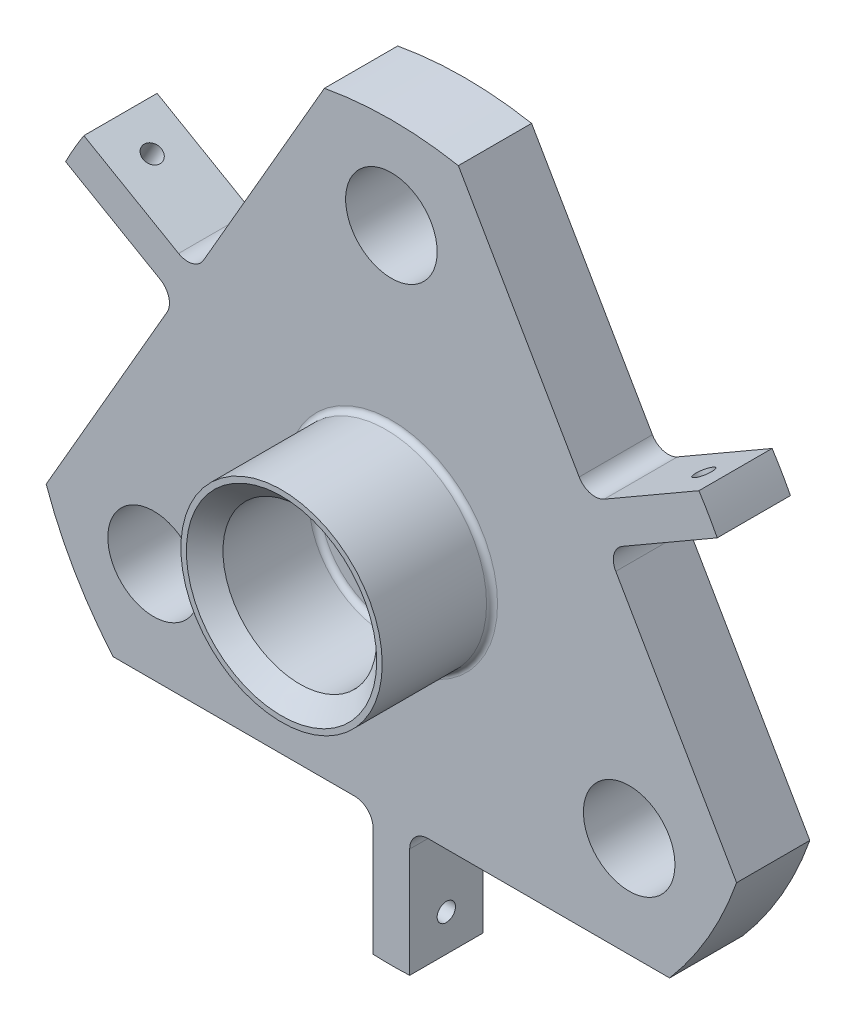
ISO-10303-21;
HEADER;
FILE_DESCRIPTION(('STEP AP214'),'2;1');
FILE_NAME('part.step','',(''),(''),'','','');
FILE_SCHEMA(('AUTOMOTIVE_DESIGN { 1 0 10303 214 1 1 1 1 }'));
ENDSEC;
DATA;
#1=APPLICATION_CONTEXT('core data for automotive mechanical design processes');
#2=APPLICATION_PROTOCOL_DEFINITION('international standard','automotive_design',2000,#1);
#3=PRODUCT_CONTEXT('',#1,'mechanical');
#4=PRODUCT('Part','Part','',(#3));
#5=PRODUCT_RELATED_PRODUCT_CATEGORY('part','',(#4));
#6=PRODUCT_DEFINITION_FORMATION('','',#4);
#7=PRODUCT_DEFINITION_CONTEXT('part definition',#1,'design');
#8=PRODUCT_DEFINITION('design','',#6,#7);
#9=PRODUCT_DEFINITION_SHAPE('','',#8);
#10=(LENGTH_UNIT() NAMED_UNIT(*) SI_UNIT(.MILLI.,.METRE.));
#11=(NAMED_UNIT(*) PLANE_ANGLE_UNIT() SI_UNIT($,.RADIAN.));
#12=(NAMED_UNIT(*) SI_UNIT($,.STERADIAN.) SOLID_ANGLE_UNIT());
#13=UNCERTAINTY_MEASURE_WITH_UNIT(LENGTH_MEASURE(1.E-05),#10,'distance_accuracy_value','');
#14=(GEOMETRIC_REPRESENTATION_CONTEXT(3) GLOBAL_UNCERTAINTY_ASSIGNED_CONTEXT((#13)) GLOBAL_UNIT_ASSIGNED_CONTEXT((#10,
#11,#12)) REPRESENTATION_CONTEXT('',''));
#15=CARTESIAN_POINT('',(0.,0.,0.));
#16=DIRECTION('',(0.,0.,1.));
#17=DIRECTION('',(1.,0.,0.));
#18=AXIS2_PLACEMENT_3D('',#15,#16,#17);
#19=CARTESIAN_POINT('',(0.,0.,0.));
#20=DIRECTION('',(0.,0.,1.));
#21=DIRECTION('',(1.,0.,0.));
#22=AXIS2_PLACEMENT_3D('',#19,#20,#21);
#23=PLANE('',#22);
#24=CARTESIAN_POINT('',(-64.9519052838329,-37.5,0.));
#25=DIRECTION('',(0.,0.,1.));
#26=DIRECTION('',(1.,0.,0.));
#27=AXIS2_PLACEMENT_3D('',#24,#25,#26);
#28=CIRCLE('',#27,12.5);
#29=CARTESIAN_POINT('',(-52.4519052838329,-37.5,0.));
#30=VERTEX_POINT('',#29);
#31=EDGE_CURVE('E711',#30,#30,#28,.T.);
#32=ORIENTED_EDGE('',*,*,#31,.T.);
#33=EDGE_LOOP('',(#32));
#34=FACE_BOUND('',#33,.T.);
#35=CARTESIAN_POINT('',(64.9519052838329,-37.5,0.));
#36=DIRECTION('',(0.,0.,1.));
#37=DIRECTION('',(1.,0.,0.));
#38=AXIS2_PLACEMENT_3D('',#35,#36,#37);
#39=CIRCLE('',#38,12.5);
#40=CARTESIAN_POINT('',(77.4519052838329,-37.5,0.));
#41=VERTEX_POINT('',#40);
#42=EDGE_CURVE('E725',#41,#41,#39,.T.);
#43=ORIENTED_EDGE('',*,*,#42,.T.);
#44=EDGE_LOOP('',(#43));
#45=FACE_BOUND('',#44,.T.);
#46=CARTESIAN_POINT('',(0.,75.,0.));
#47=DIRECTION('',(0.,0.,1.));
#48=DIRECTION('',(1.,0.,0.));
#49=AXIS2_PLACEMENT_3D('',#46,#47,#48);
#50=CIRCLE('',#49,12.5);
#51=CARTESIAN_POINT('',(12.5,75.,0.));
#52=VERTEX_POINT('',#51);
#53=EDGE_CURVE('E712',#52,#52,#50,.T.);
#54=ORIENTED_EDGE('',*,*,#53,.T.);
#55=EDGE_LOOP('',(#54));
#56=FACE_BOUND('',#55,.T.);
#57=DIRECTION('',(0.5,0.866025403784438,0.));
#58=VECTOR('',#57,1.);
#59=CARTESIAN_POINT('',(-51.2916512459883,41.1602540378444,0.));
#60=LINE('',#59,#58);
#61=CARTESIAN_POINT('',(-51.2916512459883,41.1602540378444,0.));
#62=VERTEX_POINT('',#61);
#63=CARTESIAN_POINT('',(-18.2949408620616,98.312232905441,0.));
#64=VERTEX_POINT('',#63);
#65=EDGE_CURVE('E609',#62,#64,#60,.T.);
#66=ORIENTED_EDGE('',*,*,#65,.T.);
#67=CARTESIAN_POINT('',(0.,0.,0.));
#68=DIRECTION('',(0.,0.,1.));
#69=DIRECTION('',(1.,0.,0.));
#70=AXIS2_PLACEMENT_3D('',#67,#68,#69);
#71=CIRCLE('',#70,100.);
#72=CARTESIAN_POINT('',(18.2949408620678,98.3122329054398,0.));
#73=VERTEX_POINT('',#72);
#74=EDGE_CURVE('E746',#73,#64,#71,.T.);
#75=ORIENTED_EDGE('',*,*,#74,.F.);
#76=DIRECTION('',(-0.5,0.866025403784439,0.));
#77=VECTOR('',#76,1.);
#78=CARTESIAN_POINT('',(51.2916512459925,41.1602540378466,0.));
#79=LINE('',#78,#77);
#80=CARTESIAN_POINT('',(51.2916512459925,41.1602540378466,0.));
#81=VERTEX_POINT('',#80);
#82=EDGE_CURVE('E574',#81,#73,#79,.T.);
#83=ORIENTED_EDGE('',*,*,#82,.F.);
#84=CARTESIAN_POINT('',(55.621778264911,43.6602540378445,0.));
#85=DIRECTION('',(0.,0.,-1.));
#86=DIRECTION('',(-1.,0.,0.));
#87=AXIS2_PLACEMENT_3D('',#84,#85,#86);
#88=CIRCLE('',#87,4.99999999999548);
#89=CARTESIAN_POINT('',(58.1217782649084,39.330127018926,0.));
#90=VERTEX_POINT('',#89);
#91=EDGE_CURVE('E565',#90,#81,#88,.T.);
#92=ORIENTED_EDGE('',*,*,#91,.F.);
#93=DIRECTION('',(-0.866025403784438,-0.500000000000001,0.));
#94=VECTOR('',#93,1.);
#95=CARTESIAN_POINT('',(110.083302491975,69.3301270189263,0.));
#96=LINE('',#95,#94);
#97=CARTESIAN_POINT('',(83.9942194600286,54.2675879075213,0.));
#98=VERTEX_POINT('',#97);
#99=EDGE_CURVE('E552',#98,#90,#96,.T.);
#100=ORIENTED_EDGE('',*,*,#99,.F.);
#101=CARTESIAN_POINT('',(88.994219460031,45.6073338696731,0.));
#102=VERTEX_POINT('',#101);
#103=EDGE_CURVE('E743',#102,#98,#71,.T.);
#104=ORIENTED_EDGE('',*,*,#103,.F.);
#105=DIRECTION('',(-0.866025403784438,-0.500000000000001,0.));
#106=VECTOR('',#105,1.);
#107=CARTESIAN_POINT('',(115.083302491977,60.6698729810777,0.));
#108=LINE('',#107,#106);
#109=CARTESIAN_POINT('',(63.1217782649107,30.6698729810778,0.));
#110=VERTEX_POINT('',#109);
#111=EDGE_CURVE('E658',#102,#110,#108,.T.);
#112=ORIENTED_EDGE('',*,*,#111,.T.);
#113=CARTESIAN_POINT('',(65.6217782649107,26.3397459621556,0.));
#114=DIRECTION('',(0.,0.,-1.));
#115=DIRECTION('',(-1.,0.,0.));
#116=AXIS2_PLACEMENT_3D('',#113,#114,#115);
#117=CIRCLE('',#116,5.);
#118=CARTESIAN_POINT('',(61.2916512459885,23.8397459621556,0.));
#119=VERTEX_POINT('',#118);
#120=EDGE_CURVE('E654',#119,#110,#117,.T.);
#121=ORIENTED_EDGE('',*,*,#120,.F.);
#122=DIRECTION('',(0.5,-0.866025403784439,0.));
#123=VECTOR('',#122,1.);
#124=CARTESIAN_POINT('',(61.2916512459886,23.8397459621555,0.));
#125=LINE('',#124,#123);
#126=CARTESIAN_POINT('',(94.2883616299152,-33.312232905441,0.));
#127=VERTEX_POINT('',#126);
#128=EDGE_CURVE('E622',#119,#127,#125,.T.);
#129=ORIENTED_EDGE('',*,*,#128,.T.);
#130=CARTESIAN_POINT('',(75.9934207678494,-65.0000000000045,0.));
#131=VERTEX_POINT('',#130);
#132=EDGE_CURVE('E716',#131,#127,#71,.T.);
#133=ORIENTED_EDGE('',*,*,#132,.F.);
#134=DIRECTION('',(1.,0.,0.));
#135=VECTOR('',#134,1.);
#136=CARTESIAN_POINT('',(10.,-65.0000000000045,0.));
#137=LINE('',#136,#135);
#138=CARTESIAN_POINT('',(10.,-65.0000000000045,0.));
#139=VERTEX_POINT('',#138);
#140=EDGE_CURVE('E643',#139,#131,#137,.T.);
#141=ORIENTED_EDGE('',*,*,#140,.F.);
#142=CARTESIAN_POINT('',(10.,-70.,0.));
#143=DIRECTION('',(0.,0.,-1.));
#144=DIRECTION('',(-1.,0.,0.));
#145=AXIS2_PLACEMENT_3D('',#142,#143,#144);
#146=CIRCLE('',#145,4.99999999999547);
#147=CARTESIAN_POINT('',(5.00000000000454,-69.9999999999999,0.));
#148=VERTEX_POINT('',#147);
#149=EDGE_CURVE('E642',#148,#139,#146,.T.);
#150=ORIENTED_EDGE('',*,*,#149,.F.);
#151=DIRECTION('',(0.,1.,0.));
#152=VECTOR('',#151,1.);
#153=CARTESIAN_POINT('',(5.00000000000453,-130.,0.));
#154=LINE('',#153,#152);
#155=CARTESIAN_POINT('',(5.00000000000453,-99.8749217771907,0.));
#156=VERTEX_POINT('',#155);
#157=EDGE_CURVE('E629',#156,#148,#154,.T.);
#158=ORIENTED_EDGE('',*,*,#157,.F.);
#159=CARTESIAN_POINT('',(-5.00000000000001,-99.8749217771909,0.));
#160=VERTEX_POINT('',#159);
#161=EDGE_CURVE('E1073',#160,#156,#71,.T.);
#162=ORIENTED_EDGE('',*,*,#161,.F.);
#163=DIRECTION('',(0.,1.,0.));
#164=VECTOR('',#163,1.);
#165=CARTESIAN_POINT('',(-5.00000000000001,-130.,0.));
#166=LINE('',#165,#164);
#167=CARTESIAN_POINT('',(-5.00000000000001,-70.,0.));
#168=VERTEX_POINT('',#167);
#169=EDGE_CURVE('E590',#160,#168,#166,.T.);
#170=ORIENTED_EDGE('',*,*,#169,.T.);
#171=CARTESIAN_POINT('',(-10.,-70.,0.));
#172=DIRECTION('',(0.,0.,-1.));
#173=DIRECTION('',(-1.,0.,0.));
#174=AXIS2_PLACEMENT_3D('',#171,#172,#173);
#175=CIRCLE('',#174,5.);
#176=CARTESIAN_POINT('',(-10.,-65.,0.));
#177=VERTEX_POINT('',#176);
#178=EDGE_CURVE('E595',#177,#168,#175,.T.);
#179=ORIENTED_EDGE('',*,*,#178,.F.);
#180=DIRECTION('',(-1.,0.,0.));
#181=VECTOR('',#180,1.);
#182=CARTESIAN_POINT('',(-10.,-65.,0.));
#183=LINE('',#182,#181);
#184=CARTESIAN_POINT('',(-75.9934207678533,-65.,0.));
#185=VERTEX_POINT('',#184);
#186=EDGE_CURVE('E591',#177,#185,#183,.T.);
#187=ORIENTED_EDGE('',*,*,#186,.T.);
#188=CARTESIAN_POINT('',(-94.2883616299172,-33.3122329054353,0.));
#189=VERTEX_POINT('',#188);
#190=EDGE_CURVE('E1075',#189,#185,#71,.T.);
#191=ORIENTED_EDGE('',*,*,#190,.F.);
#192=DIRECTION('',(-0.5,-0.866025403784438,0.));
#193=VECTOR('',#192,1.);
#194=CARTESIAN_POINT('',(-61.2916512459924,23.8397459621579,0.));
#195=LINE('',#194,#193);
#196=CARTESIAN_POINT('',(-61.2916512459924,23.8397459621579,0.));
#197=VERTEX_POINT('',#196);
#198=EDGE_CURVE('E619',#197,#189,#195,.T.);
#199=ORIENTED_EDGE('',*,*,#198,.F.);
#200=CARTESIAN_POINT('',(-65.6217782649108,26.3397459621558,0.));
#201=DIRECTION('',(0.,0.,-1.));
#202=DIRECTION('',(-1.,0.,0.));
#203=AXIS2_PLACEMENT_3D('',#200,#201,#202);
#204=CIRCLE('',#203,4.99999999999547);
#205=CARTESIAN_POINT('',(-63.1217782649127,30.6698729810739,0.));
#206=VERTEX_POINT('',#205);
#207=EDGE_CURVE('E633',#206,#197,#204,.T.);
#208=ORIENTED_EDGE('',*,*,#207,.F.);
#209=DIRECTION('',(0.866025403784439,-0.499999999999999,0.));
#210=VECTOR('',#209,1.);
#211=CARTESIAN_POINT('',(-115.08330249198,60.6698729810742,0.));
#212=LINE('',#211,#210);
#213=CARTESIAN_POINT('',(-88.994219460033,45.6073338696693,0.));
#214=VERTEX_POINT('',#213);
#215=EDGE_CURVE('E623',#214,#206,#212,.T.);
#216=ORIENTED_EDGE('',*,*,#215,.F.);
#217=CARTESIAN_POINT('',(-83.9942194600309,54.2675879075178,0.));
#218=VERTEX_POINT('',#217);
#219=EDGE_CURVE('E1079',#218,#214,#71,.T.);
#220=ORIENTED_EDGE('',*,*,#219,.F.);
#221=DIRECTION('',(0.866025403784439,-0.499999999999999,0.));
#222=VECTOR('',#221,1.);
#223=CARTESIAN_POINT('',(-110.083302491977,69.3301270189223,0.));
#224=LINE('',#223,#222);
#225=CARTESIAN_POINT('',(-58.1217782649105,39.3301270189222,0.));
#226=VERTEX_POINT('',#225);
#227=EDGE_CURVE('E608',#218,#226,#224,.T.);
#228=ORIENTED_EDGE('',*,*,#227,.T.);
#229=CARTESIAN_POINT('',(-55.6217782649106,43.6602540378444,0.));
#230=DIRECTION('',(0.,0.,-1.));
#231=DIRECTION('',(-1.,0.,0.));
#232=AXIS2_PLACEMENT_3D('',#229,#230,#231);
#233=CIRCLE('',#232,5.);
#234=EDGE_CURVE('E602',#62,#226,#233,.T.);
#235=ORIENTED_EDGE('',*,*,#234,.F.);
#236=EDGE_LOOP('',(#66,#75,#83,#92,#100,#104,#112,#121,#129,#133,#141,#150,#158,#162,#170,#179,
#187,#191,#199,#208,#216,#220,#228,#235));
#237=FACE_BOUND('',#236,.T.);
#238=ADVANCED_FACE('F388',(#34,#45,#56,#237),#23,.F.);
#239=CARTESIAN_POINT('',(0.,0.,20.));
#240=DIRECTION('',(0.,0.,-1.));
#241=DIRECTION('',(-1.,0.,0.));
#242=AXIS2_PLACEMENT_3D('',#239,#240,#241);
#243=CYLINDRICAL_SURFACE('',#242,100.);
#244=DIRECTION('',(0.,0.,-1.));
#245=VECTOR('',#244,1.);
#246=CARTESIAN_POINT('',(-18.2949408620616,98.312232905441,20.));
#247=LINE('',#246,#245);
#248=CARTESIAN_POINT('',(-18.2949408620616,98.312232905441,20.));
#249=VERTEX_POINT('',#248);
#250=EDGE_CURVE('E708',#249,#64,#247,.T.);
#251=ORIENTED_EDGE('',*,*,#250,.F.);
#252=CARTESIAN_POINT('',(0.,0.,20.));
#253=DIRECTION('',(0.,0.,1.));
#254=DIRECTION('',(1.,0.,0.));
#255=AXIS2_PLACEMENT_3D('',#252,#253,#254);
#256=CIRCLE('',#255,100.);
#257=CARTESIAN_POINT('',(18.2949408620678,98.3122329054398,20.));
#258=VERTEX_POINT('',#257);
#259=EDGE_CURVE('E741',#258,#249,#256,.T.);
#260=ORIENTED_EDGE('',*,*,#259,.F.);
#261=DIRECTION('',(0.,0.,-1.));
#262=VECTOR('',#261,1.);
#263=CARTESIAN_POINT('',(18.2949408620678,98.3122329054398,20.));
#264=LINE('',#263,#262);
#265=EDGE_CURVE('E679',#258,#73,#264,.T.);
#266=ORIENTED_EDGE('',*,*,#265,.T.);
#267=ORIENTED_EDGE('',*,*,#74,.T.);
#268=EDGE_LOOP('',(#251,#260,#266,#267));
#269=FACE_BOUND('',#268,.T.);
#270=ADVANCED_FACE('F932',(#269),#243,.T.);
#271=DIRECTION('',(0.,0.,-1.));
#272=VECTOR('',#271,1.);
#273=CARTESIAN_POINT('',(-83.9942194600309,54.2675879075177,20.));
#274=LINE('',#273,#272);
#275=CARTESIAN_POINT('',(-83.9942194600309,54.2675879075178,20.));
#276=VERTEX_POINT('',#275);
#277=EDGE_CURVE('E705',#218,#276,#274,.F.);
#278=ORIENTED_EDGE('',*,*,#277,.F.);
#279=ORIENTED_EDGE('',*,*,#219,.T.);
#280=DIRECTION('',(0.,0.,-1.));
#281=VECTOR('',#280,1.);
#282=CARTESIAN_POINT('',(-88.994219460033,45.6073338696693,20.));
#283=LINE('',#282,#281);
#284=CARTESIAN_POINT('',(-88.994219460033,45.6073338696693,20.));
#285=VERTEX_POINT('',#284);
#286=EDGE_CURVE('E687',#214,#285,#283,.F.);
#287=ORIENTED_EDGE('',*,*,#286,.T.);
#288=EDGE_CURVE('E876',#276,#285,#256,.T.);
#289=ORIENTED_EDGE('',*,*,#288,.F.);
#290=EDGE_LOOP('',(#278,#279,#287,#289));
#291=FACE_BOUND('',#290,.T.);
#292=ADVANCED_FACE('F877',(#291),#243,.T.);
#293=DIRECTION('',(0.,0.,-1.));
#294=VECTOR('',#293,1.);
#295=CARTESIAN_POINT('',(-75.9934207678533,-65.,20.));
#296=LINE('',#295,#294);
#297=CARTESIAN_POINT('',(-75.9934207678533,-65.,20.));
#298=VERTEX_POINT('',#297);
#299=EDGE_CURVE('E702',#298,#185,#296,.T.);
#300=ORIENTED_EDGE('',*,*,#299,.F.);
#301=CARTESIAN_POINT('',(-94.2883616299172,-33.3122329054353,20.));
#302=VERTEX_POINT('',#301);
#303=EDGE_CURVE('E879',#302,#298,#256,.T.);
#304=ORIENTED_EDGE('',*,*,#303,.F.);
#305=DIRECTION('',(0.,0.,-1.));
#306=VECTOR('',#305,1.);
#307=CARTESIAN_POINT('',(-94.2883616299172,-33.3122329054353,20.));
#308=LINE('',#307,#306);
#309=EDGE_CURVE('E683',#302,#189,#308,.T.);
#310=ORIENTED_EDGE('',*,*,#309,.T.);
#311=ORIENTED_EDGE('',*,*,#190,.T.);
#312=EDGE_LOOP('',(#300,#304,#310,#311));
#313=FACE_BOUND('',#312,.T.);
#314=ADVANCED_FACE('F1098',(#313),#243,.T.);
#315=DIRECTION('',(0.,0.,-1.));
#316=VECTOR('',#315,1.);
#317=CARTESIAN_POINT('',(-5.00000000000001,-99.8749217771909,20.));
#318=LINE('',#317,#316);
#319=CARTESIAN_POINT('',(-5.00000000000001,-99.8749217771909,20.));
#320=VERTEX_POINT('',#319);
#321=EDGE_CURVE('E699',#160,#320,#318,.F.);
#322=ORIENTED_EDGE('',*,*,#321,.F.);
#323=ORIENTED_EDGE('',*,*,#161,.T.);
#324=DIRECTION('',(0.,0.,-1.));
#325=VECTOR('',#324,1.);
#326=CARTESIAN_POINT('',(5.00000000000453,-99.8749217771907,20.));
#327=LINE('',#326,#325);
#328=CARTESIAN_POINT('',(5.00000000000453,-99.8749217771907,20.));
#329=VERTEX_POINT('',#328);
#330=EDGE_CURVE('E691',#156,#329,#327,.F.);
#331=ORIENTED_EDGE('',*,*,#330,.T.);
#332=EDGE_CURVE('E883',#320,#329,#256,.T.);
#333=ORIENTED_EDGE('',*,*,#332,.F.);
#334=EDGE_LOOP('',(#322,#323,#331,#333));
#335=FACE_BOUND('',#334,.T.);
#336=ADVANCED_FACE('F1071',(#335),#243,.T.);
#337=CARTESIAN_POINT('',(75.9934207678495,-65.0000000000045,20.));
#338=VERTEX_POINT('',#337);
#339=CARTESIAN_POINT('',(94.2883616299152,-33.3122329054409,20.));
#340=VERTEX_POINT('',#339);
#341=EDGE_CURVE('E742',#338,#340,#256,.T.);
#342=ORIENTED_EDGE('',*,*,#341,.F.);
#343=DIRECTION('',(0.,0.,-1.));
#344=VECTOR('',#343,1.);
#345=CARTESIAN_POINT('',(75.9934207678495,-65.0000000000045,20.));
#346=LINE('',#345,#344);
#347=EDGE_CURVE('E695',#338,#131,#346,.T.);
#348=ORIENTED_EDGE('',*,*,#347,.T.);
#349=ORIENTED_EDGE('',*,*,#132,.T.);
#350=DIRECTION('',(0.,0.,-1.));
#351=VECTOR('',#350,1.);
#352=CARTESIAN_POINT('',(94.2883616299152,-33.3122329054409,20.));
#353=LINE('',#352,#351);
#354=EDGE_CURVE('E668',#340,#127,#353,.T.);
#355=ORIENTED_EDGE('',*,*,#354,.F.);
#356=EDGE_LOOP('',(#342,#348,#349,#355));
#357=FACE_BOUND('',#356,.T.);
#358=ADVANCED_FACE('F898',(#357),#243,.T.);
#359=ORIENTED_EDGE('',*,*,#103,.T.);
#360=DIRECTION('',(0.,0.,-1.));
#361=VECTOR('',#360,1.);
#362=CARTESIAN_POINT('',(83.9942194600286,54.2675879075214,20.));
#363=LINE('',#362,#361);
#364=CARTESIAN_POINT('',(83.9942194600286,54.2675879075214,20.));
#365=VERTEX_POINT('',#364);
#366=EDGE_CURVE('E558',#98,#365,#363,.F.);
#367=ORIENTED_EDGE('',*,*,#366,.T.);
#368=CARTESIAN_POINT('',(88.994219460031,45.6073338696732,20.));
#369=VERTEX_POINT('',#368);
#370=EDGE_CURVE('E736',#369,#365,#256,.T.);
#371=ORIENTED_EDGE('',*,*,#370,.F.);
#372=DIRECTION('',(0.,0.,-1.));
#373=VECTOR('',#372,1.);
#374=CARTESIAN_POINT('',(88.994219460031,45.6073338696731,20.));
#375=LINE('',#374,#373);
#376=EDGE_CURVE('E674',#102,#369,#375,.F.);
#377=ORIENTED_EDGE('',*,*,#376,.F.);
#378=EDGE_LOOP('',(#359,#367,#371,#377));
#379=FACE_BOUND('',#378,.T.);
#380=ADVANCED_FACE('F913',(#379),#243,.T.);
#381=CARTESIAN_POINT('',(0.,0.,20.));
#382=DIRECTION('',(0.,0.,1.));
#383=DIRECTION('',(1.,0.,0.));
#384=AXIS2_PLACEMENT_3D('',#381,#382,#383);
#385=PLANE('',#384);
#386=CARTESIAN_POINT('',(0.,75.,20.));
#387=DIRECTION('',(0.,0.,1.));
#388=DIRECTION('',(1.,0.,0.));
#389=AXIS2_PLACEMENT_3D('',#386,#387,#388);
#390=CIRCLE('',#389,12.5);
#391=CARTESIAN_POINT('',(12.5,75.,20.));
#392=VERTEX_POINT('',#391);
#393=EDGE_CURVE('E717',#392,#392,#390,.T.);
#394=ORIENTED_EDGE('',*,*,#393,.F.);
#395=EDGE_LOOP('',(#394));
#396=FACE_BOUND('',#395,.T.);
#397=CARTESIAN_POINT('',(64.9519052838329,-37.5,20.));
#398=DIRECTION('',(0.,0.,1.));
#399=DIRECTION('',(1.,0.,0.));
#400=AXIS2_PLACEMENT_3D('',#397,#398,#399);
#401=CIRCLE('',#400,12.5);
#402=CARTESIAN_POINT('',(77.4519052838329,-37.5,20.));
#403=VERTEX_POINT('',#402);
#404=EDGE_CURVE('E721',#403,#403,#401,.T.);
#405=ORIENTED_EDGE('',*,*,#404,.F.);
#406=EDGE_LOOP('',(#405));
#407=FACE_BOUND('',#406,.T.);
#408=CARTESIAN_POINT('',(-64.9519052838329,-37.5,20.));
#409=DIRECTION('',(0.,0.,1.));
#410=DIRECTION('',(1.,0.,0.));
#411=AXIS2_PLACEMENT_3D('',#408,#409,#410);
#412=CIRCLE('',#411,12.5);
#413=CARTESIAN_POINT('',(-52.4519052838329,-37.5,20.));
#414=VERTEX_POINT('',#413);
#415=EDGE_CURVE('E729',#414,#414,#412,.T.);
#416=ORIENTED_EDGE('',*,*,#415,.F.);
#417=EDGE_LOOP('',(#416));
#418=FACE_BOUND('',#417,.T.);
#419=CARTESIAN_POINT('',(0.,0.,20.));
#420=DIRECTION('',(0.,0.,1.));
#421=DIRECTION('',(1.,0.,0.));
#422=AXIS2_PLACEMENT_3D('',#419,#420,#421);
#423=CIRCLE('',#422,29.);
#424=CARTESIAN_POINT('',(29.,0.,20.));
#425=VERTEX_POINT('',#424);
#426=EDGE_CURVE('E770',#425,#425,#423,.F.);
#427=ORIENTED_EDGE('',*,*,#426,.T.);
#428=EDGE_LOOP('',(#427));
#429=FACE_BOUND('',#428,.T.);
#430=ORIENTED_EDGE('',*,*,#259,.T.);
#431=DIRECTION('',(-0.5,-0.866025403784438,0.));
#432=VECTOR('',#431,1.);
#433=CARTESIAN_POINT('',(-56.2916512459884,32.5,20.));
#434=LINE('',#433,#432);
#435=CARTESIAN_POINT('',(-51.2916512459883,41.1602540378444,20.));
#436=VERTEX_POINT('',#435);
#437=EDGE_CURVE('E12',#249,#436,#434,.T.);
#438=ORIENTED_EDGE('',*,*,#437,.T.);
#439=CARTESIAN_POINT('',(-55.6217782649106,43.6602540378444,20.));
#440=DIRECTION('',(0.,0.,1.));
#441=DIRECTION('',(1.,0.,0.));
#442=AXIS2_PLACEMENT_3D('',#439,#440,#441);
#443=CIRCLE('',#442,5.);
#444=CARTESIAN_POINT('',(-58.1217782649106,39.3301270189222,20.));
#445=VERTEX_POINT('',#444);
#446=EDGE_CURVE('E825',#445,#436,#443,.T.);
#447=ORIENTED_EDGE('',*,*,#446,.F.);
#448=DIRECTION('',(-0.866025403784439,0.5,0.));
#449=VECTOR('',#448,1.);
#450=CARTESIAN_POINT('',(2.50000000000009,4.33012701892236,20.));
#451=LINE('',#450,#449);
#452=EDGE_CURVE('E398',#445,#276,#451,.T.);
#453=ORIENTED_EDGE('',*,*,#452,.T.);
#454=ORIENTED_EDGE('',*,*,#288,.T.);
#455=DIRECTION('',(-0.866025403784439,0.499999999999999,0.));
#456=VECTOR('',#455,1.);
#457=CARTESIAN_POINT('',(-2.50000000000215,-4.33012701892593,20.));
#458=LINE('',#457,#456);
#459=CARTESIAN_POINT('',(-63.1217782649127,30.6698729810739,20.));
#460=VERTEX_POINT('',#459);
#461=EDGE_CURVE('E801',#460,#285,#458,.T.);
#462=ORIENTED_EDGE('',*,*,#461,.F.);
#463=CARTESIAN_POINT('',(-65.6217782649108,26.3397459621558,20.));
#464=DIRECTION('',(0.,0.,1.));
#465=DIRECTION('',(1.,0.,0.));
#466=AXIS2_PLACEMENT_3D('',#463,#464,#465);
#467=CIRCLE('',#466,4.99999999999547);
#468=CARTESIAN_POINT('',(-61.2916512459925,23.839745962158,20.));
#469=VERTEX_POINT('',#468);
#470=EDGE_CURVE('E798',#469,#460,#467,.T.);
#471=ORIENTED_EDGE('',*,*,#470,.F.);
#472=DIRECTION('',(0.5,0.866025403784438,0.));
#473=VECTOR('',#472,1.);
#474=CARTESIAN_POINT('',(-56.2916512459924,32.5000000000023,20.));
#475=LINE('',#474,#473);
#476=EDGE_CURVE('E795',#302,#469,#475,.T.);
#477=ORIENTED_EDGE('',*,*,#476,.F.);
#478=ORIENTED_EDGE('',*,*,#303,.T.);
#479=DIRECTION('',(1.,0.,0.));
#480=VECTOR('',#479,1.);
#481=CARTESIAN_POINT('',(0.,-65.,20.));
#482=LINE('',#481,#480);
#483=CARTESIAN_POINT('',(-10.,-65.,20.));
#484=VERTEX_POINT('',#483);
#485=EDGE_CURVE('E821',#298,#484,#482,.T.);
#486=ORIENTED_EDGE('',*,*,#485,.T.);
#487=CARTESIAN_POINT('',(-10.,-70.,20.));
#488=DIRECTION('',(0.,0.,1.));
#489=DIRECTION('',(1.,0.,0.));
#490=AXIS2_PLACEMENT_3D('',#487,#488,#489);
#491=CIRCLE('',#490,5.);
#492=CARTESIAN_POINT('',(-5.00000000000001,-70.,20.));
#493=VERTEX_POINT('',#492);
#494=EDGE_CURVE('E814',#493,#484,#491,.T.);
#495=ORIENTED_EDGE('',*,*,#494,.F.);
#496=DIRECTION('',(0.,-1.,0.));
#497=VECTOR('',#496,1.);
#498=CARTESIAN_POINT('',(-5.00000000000001,0.,20.));
#499=LINE('',#498,#497);
#500=EDGE_CURVE('E817',#493,#320,#499,.T.);
#501=ORIENTED_EDGE('',*,*,#500,.T.);
#502=ORIENTED_EDGE('',*,*,#332,.T.);
#503=DIRECTION('',(0.,-1.,0.));
#504=VECTOR('',#503,1.);
#505=CARTESIAN_POINT('',(5.00000000000452,0.,20.));
#506=LINE('',#505,#504);
#507=CARTESIAN_POINT('',(5.00000000000453,-69.9999999999999,20.));
#508=VERTEX_POINT('',#507);
#509=EDGE_CURVE('E804',#508,#329,#506,.T.);
#510=ORIENTED_EDGE('',*,*,#509,.F.);
#511=CARTESIAN_POINT('',(10.,-70.,20.));
#512=DIRECTION('',(0.,0.,1.));
#513=DIRECTION('',(1.,0.,0.));
#514=AXIS2_PLACEMENT_3D('',#511,#512,#513);
#515=CIRCLE('',#514,4.99999999999547);
#516=CARTESIAN_POINT('',(10.,-65.0000000000045,20.));
#517=VERTEX_POINT('',#516);
#518=EDGE_CURVE('E807',#517,#508,#515,.T.);
#519=ORIENTED_EDGE('',*,*,#518,.F.);
#520=DIRECTION('',(-1.,0.,0.));
#521=VECTOR('',#520,1.);
#522=CARTESIAN_POINT('',(0.,-65.0000000000045,20.));
#523=LINE('',#522,#521);
#524=EDGE_CURVE('E811',#338,#517,#523,.T.);
#525=ORIENTED_EDGE('',*,*,#524,.F.);
#526=ORIENTED_EDGE('',*,*,#341,.T.);
#527=DIRECTION('',(-0.5,0.866025403784439,0.));
#528=VECTOR('',#527,1.);
#529=CARTESIAN_POINT('',(56.2916512459885,32.5,20.));
#530=LINE('',#529,#528);
#531=CARTESIAN_POINT('',(61.2916512459886,23.8397459621555,20.));
#532=VERTEX_POINT('',#531);
#533=EDGE_CURVE('E774',#340,#532,#530,.T.);
#534=ORIENTED_EDGE('',*,*,#533,.T.);
#535=CARTESIAN_POINT('',(65.6217782649107,26.3397459621556,20.));
#536=DIRECTION('',(0.,0.,1.));
#537=DIRECTION('',(1.,0.,0.));
#538=AXIS2_PLACEMENT_3D('',#535,#536,#537);
#539=CIRCLE('',#538,5.);
#540=CARTESIAN_POINT('',(63.1217782649107,30.6698729810778,20.));
#541=VERTEX_POINT('',#540);
#542=EDGE_CURVE('E778',#541,#532,#539,.T.);
#543=ORIENTED_EDGE('',*,*,#542,.F.);
#544=DIRECTION('',(0.866025403784438,0.500000000000001,0.));
#545=VECTOR('',#544,1.);
#546=CARTESIAN_POINT('',(2.50000000000015,-4.33012701892243,20.));
#547=LINE('',#546,#545);
#548=EDGE_CURVE('E782',#541,#369,#547,.T.);
#549=ORIENTED_EDGE('',*,*,#548,.T.);
#550=ORIENTED_EDGE('',*,*,#370,.T.);
#551=DIRECTION('',(0.866025403784438,0.500000000000001,0.));
#552=VECTOR('',#551,1.);
#553=CARTESIAN_POINT('',(-2.50000000000214,4.33012701892588,20.));
#554=LINE('',#553,#552);
#555=CARTESIAN_POINT('',(58.1217782649084,39.330127018926,20.));
#556=VERTEX_POINT('',#555);
#557=EDGE_CURVE('E788',#556,#365,#554,.T.);
#558=ORIENTED_EDGE('',*,*,#557,.F.);
#559=CARTESIAN_POINT('',(55.621778264911,43.6602540378445,20.));
#560=DIRECTION('',(0.,0.,1.));
#561=DIRECTION('',(1.,0.,0.));
#562=AXIS2_PLACEMENT_3D('',#559,#560,#561);
#563=CIRCLE('',#562,4.99999999999548);
#564=CARTESIAN_POINT('',(51.2916512459927,41.1602540378467,20.));
#565=VERTEX_POINT('',#564);
#566=EDGE_CURVE('E572',#565,#556,#563,.T.);
#567=ORIENTED_EDGE('',*,*,#566,.F.);
#568=DIRECTION('',(0.5,-0.866025403784439,0.));
#569=VECTOR('',#568,1.);
#570=CARTESIAN_POINT('',(56.2916512459925,32.5000000000023,20.));
#571=LINE('',#570,#569);
#572=EDGE_CURVE('E791',#258,#565,#571,.T.);
#573=ORIENTED_EDGE('',*,*,#572,.F.);
#574=EDGE_LOOP('',(#430,#438,#447,#453,#454,#462,#471,#477,#478,#486,#495,#501,#502,#510,#519,
#525,#526,#534,#543,#549,#550,#558,#567,#573));
#575=FACE_BOUND('',#574,.T.);
#576=ADVANCED_FACE('F874',(#396,#407,#418,#429,#575),#385,.T.);
#577=CARTESIAN_POINT('',(0.,0.,50.));
#578=DIRECTION('',(0.,0.,-1.));
#579=DIRECTION('',(-1.,0.,0.));
#580=AXIS2_PLACEMENT_3D('',#577,#578,#579);
#581=CYLINDRICAL_SURFACE('',#580,21.);
#582=CARTESIAN_POINT('',(0.,0.,21.5));
#583=DIRECTION('',(0.,0.,1.));
#584=DIRECTION('',(1.,0.,0.));
#585=AXIS2_PLACEMENT_3D('',#582,#583,#584);
#586=CIRCLE('',#585,21.);
#587=CARTESIAN_POINT('',(21.,0.,21.5));
#588=VERTEX_POINT('',#587);
#589=EDGE_CURVE('E762',#588,#588,#586,.F.);
#590=ORIENTED_EDGE('',*,*,#589,.T.);
#591=EDGE_LOOP('',(#590));
#592=FACE_BOUND('',#591,.T.);
#593=CARTESIAN_POINT('',(0.,0.,45.));
#594=DIRECTION('',(0.,0.,1.));
#595=DIRECTION('',(1.,0.,0.));
#596=AXIS2_PLACEMENT_3D('',#593,#594,#595);
#597=CIRCLE('',#596,21.);
#598=CARTESIAN_POINT('',(21.,0.,45.));
#599=VERTEX_POINT('',#598);
#600=EDGE_CURVE('E750',#599,#599,#597,.T.);
#601=ORIENTED_EDGE('',*,*,#600,.T.);
#602=EDGE_LOOP('',(#601));
#603=FACE_BOUND('',#602,.T.);
#604=ADVANCED_FACE('F947',(#592,#603),#581,.F.);
#605=CARTESIAN_POINT('',(0.,0.,50.));
#606=DIRECTION('',(0.,0.,-1.));
#607=DIRECTION('',(-1.,0.,0.));
#608=AXIS2_PLACEMENT_3D('',#605,#606,#607);
#609=CYLINDRICAL_SURFACE('',#608,27.5);
#610=CARTESIAN_POINT('',(0.,0.,21.5));
#611=DIRECTION('',(0.,0.,1.));
#612=DIRECTION('',(1.,0.,0.));
#613=AXIS2_PLACEMENT_3D('',#610,#611,#612);
#614=CIRCLE('',#613,27.5);
#615=CARTESIAN_POINT('',(27.5,0.,21.5));
#616=VERTEX_POINT('',#615);
#617=EDGE_CURVE('E766',#616,#616,#614,.T.);
#618=ORIENTED_EDGE('',*,*,#617,.T.);
#619=EDGE_LOOP('',(#618));
#620=FACE_BOUND('',#619,.T.);
#621=CARTESIAN_POINT('',(0.,0.,50.));
#622=DIRECTION('',(0.,0.,1.));
#623=DIRECTION('',(1.,0.,0.));
#624=AXIS2_PLACEMENT_3D('',#621,#622,#623);
#625=CIRCLE('',#624,27.5);
#626=CARTESIAN_POINT('',(27.5,0.,50.));
#627=VERTEX_POINT('',#626);
#628=EDGE_CURVE('E740',#627,#627,#625,.T.);
#629=ORIENTED_EDGE('',*,*,#628,.F.);
#630=EDGE_LOOP('',(#629));
#631=FACE_BOUND('',#630,.T.);
#632=ADVANCED_FACE('F944',(#620,#631),#609,.T.);
#633=CARTESIAN_POINT('',(0.,0.,50.));
#634=DIRECTION('',(0.,0.,1.));
#635=DIRECTION('',(1.,0.,0.));
#636=AXIS2_PLACEMENT_3D('',#633,#634,#635);
#637=PLANE('',#636);
#638=CARTESIAN_POINT('',(0.,0.,50.));
#639=DIRECTION('',(0.,0.,1.));
#640=DIRECTION('',(1.,0.,0.));
#641=AXIS2_PLACEMENT_3D('',#638,#639,#640);
#642=CIRCLE('',#641,26.);
#643=CARTESIAN_POINT('',(26.,0.,50.));
#644=VERTEX_POINT('',#643);
#645=EDGE_CURVE('E754',#644,#644,#642,.F.);
#646=ORIENTED_EDGE('',*,*,#645,.T.);
#647=EDGE_LOOP('',(#646));
#648=FACE_BOUND('',#647,.T.);
#649=ORIENTED_EDGE('',*,*,#628,.T.);
#650=EDGE_LOOP('',(#649));
#651=FACE_BOUND('',#650,.T.);
#652=ADVANCED_FACE('F943',(#648,#651),#637,.T.);
#653=CARTESIAN_POINT('',(0.,0.,20.));
#654=DIRECTION('',(0.,0.,1.));
#655=DIRECTION('',(1.,0.,0.));
#656=AXIS2_PLACEMENT_3D('',#653,#654,#655);
#657=PLANE('',#656);
#658=CARTESIAN_POINT('',(0.,0.,20.));
#659=DIRECTION('',(0.,0.,1.));
#660=DIRECTION('',(1.,0.,0.));
#661=AXIS2_PLACEMENT_3D('',#658,#659,#660);
#662=CIRCLE('',#661,19.5);
#663=CARTESIAN_POINT('',(19.5,0.,20.));
#664=VERTEX_POINT('',#663);
#665=EDGE_CURVE('E758',#664,#664,#662,.T.);
#666=ORIENTED_EDGE('',*,*,#665,.T.);
#667=EDGE_LOOP('',(#666));
#668=FACE_BOUND('',#667,.T.);
#669=ADVANCED_FACE('F958',(#668),#657,.T.);
#670=CARTESIAN_POINT('',(0.,0.,45.));
#671=DIRECTION('',(0.,0.,1.));
#672=DIRECTION('',(1.,0.,0.));
#673=AXIS2_PLACEMENT_3D('',#670,#671,#672);
#674=CONICAL_SURFACE('',#673,21.,0.785398163397451);
#675=ORIENTED_EDGE('',*,*,#645,.F.);
#676=EDGE_LOOP('',(#675));
#677=FACE_BOUND('',#676,.T.);
#678=ORIENTED_EDGE('',*,*,#600,.F.);
#679=EDGE_LOOP('',(#678));
#680=FACE_BOUND('',#679,.T.);
#681=ADVANCED_FACE('F953',(#677,#680),#674,.F.);
#682=CARTESIAN_POINT('',(0.,0.,21.5));
#683=DIRECTION('',(0.,0.,1.));
#684=DIRECTION('',(1.,0.,0.));
#685=AXIS2_PLACEMENT_3D('',#682,#683,#684);
#686=TOROIDAL_SURFACE('',#685,19.5,1.5);
#687=ORIENTED_EDGE('',*,*,#589,.F.);
#688=EDGE_LOOP('',(#687));
#689=FACE_BOUND('',#688,.T.);
#690=ORIENTED_EDGE('',*,*,#665,.F.);
#691=EDGE_LOOP('',(#690));
#692=FACE_BOUND('',#691,.T.);
#693=ADVANCED_FACE('F957',(#689,#692),#686,.F.);
#694=CARTESIAN_POINT('',(0.,0.,21.5));
#695=DIRECTION('',(0.,0.,1.));
#696=DIRECTION('',(1.,0.,0.));
#697=AXIS2_PLACEMENT_3D('',#694,#695,#696);
#698=TOROIDAL_SURFACE('',#697,29.,1.5);
#699=ORIENTED_EDGE('',*,*,#426,.F.);
#700=EDGE_LOOP('',(#699));
#701=FACE_BOUND('',#700,.T.);
#702=ORIENTED_EDGE('',*,*,#617,.F.);
#703=EDGE_LOOP('',(#702));
#704=FACE_BOUND('',#703,.T.);
#705=ADVANCED_FACE('F390',(#701,#704),#698,.F.);
#706=CARTESIAN_POINT('',(-64.9519052838329,-37.5,0.));
#707=DIRECTION('',(0.,0.,1.));
#708=DIRECTION('',(1.,0.,0.));
#709=AXIS2_PLACEMENT_3D('',#706,#707,#708);
#710=CYLINDRICAL_SURFACE('',#709,12.5);
#711=ORIENTED_EDGE('',*,*,#31,.F.);
#712=EDGE_LOOP('',(#711));
#713=FACE_BOUND('',#712,.T.);
#714=ORIENTED_EDGE('',*,*,#415,.T.);
#715=EDGE_LOOP('',(#714));
#716=FACE_BOUND('',#715,.T.);
#717=ADVANCED_FACE('F965',(#713,#716),#710,.F.);
#718=CARTESIAN_POINT('',(64.9519052838329,-37.5,0.));
#719=DIRECTION('',(0.,0.,1.));
#720=DIRECTION('',(1.,0.,0.));
#721=AXIS2_PLACEMENT_3D('',#718,#719,#720);
#722=CYLINDRICAL_SURFACE('',#721,12.5);
#723=ORIENTED_EDGE('',*,*,#42,.F.);
#724=EDGE_LOOP('',(#723));
#725=FACE_BOUND('',#724,.T.);
#726=ORIENTED_EDGE('',*,*,#404,.T.);
#727=EDGE_LOOP('',(#726));
#728=FACE_BOUND('',#727,.T.);
#729=ADVANCED_FACE('F926',(#725,#728),#722,.F.);
#730=CARTESIAN_POINT('',(0.,75.,0.));
#731=DIRECTION('',(0.,0.,1.));
#732=DIRECTION('',(1.,0.,0.));
#733=AXIS2_PLACEMENT_3D('',#730,#731,#732);
#734=CYLINDRICAL_SURFACE('',#733,12.5);
#735=ORIENTED_EDGE('',*,*,#53,.F.);
#736=EDGE_LOOP('',(#735));
#737=FACE_BOUND('',#736,.T.);
#738=ORIENTED_EDGE('',*,*,#393,.T.);
#739=EDGE_LOOP('',(#738));
#740=FACE_BOUND('',#739,.T.);
#741=ADVANCED_FACE('F916',(#737,#740),#734,.F.);
#742=CARTESIAN_POINT('',(115.083302491977,60.6698729810777,50.));
#743=DIRECTION('',(0.500000000000001,-0.866025403784438,0.));
#744=DIRECTION('',(0.866025403784438,0.500000000000001,0.));
#745=AXIS2_PLACEMENT_3D('',#742,#743,#744);
#746=PLANE('',#745);
#747=CARTESIAN_POINT('',(80.3339654221866,40.6073338696731,10.));
#748=DIRECTION('',(0.500000000000002,-0.866025403784438,0.));
#749=DIRECTION('',(0.866025403784438,0.500000000000002,0.));
#750=AXIS2_PLACEMENT_3D('',#747,#748,#749);
#751=CIRCLE('',#750,2.5);
#752=CARTESIAN_POINT('',(82.4990289316477,41.8573338696731,10.));
#753=VERTEX_POINT('',#752);
#754=EDGE_CURVE('E832',#753,#753,#751,.T.);
#755=ORIENTED_EDGE('',*,*,#754,.F.);
#756=EDGE_LOOP('',(#755));
#757=FACE_BOUND('',#756,.T.);
#758=ORIENTED_EDGE('',*,*,#376,.T.);
#759=ORIENTED_EDGE('',*,*,#548,.F.);
#760=DIRECTION('',(0.,0.,-1.));
#761=VECTOR('',#760,1.);
#762=CARTESIAN_POINT('',(63.1217782649107,30.6698729810778,50.));
#763=LINE('',#762,#761);
#764=EDGE_CURVE('E662',#541,#110,#763,.T.);
#765=ORIENTED_EDGE('',*,*,#764,.T.);
#766=ORIENTED_EDGE('',*,*,#111,.F.);
#767=EDGE_LOOP('',(#758,#759,#765,#766));
#768=FACE_BOUND('',#767,.T.);
#769=ADVANCED_FACE('F914',(#757,#768),#746,.T.);
#770=CARTESIAN_POINT('',(61.2916512459886,23.8397459621555,50.));
#771=DIRECTION('',(0.866025403784439,0.5,0.));
#772=DIRECTION('',(-0.5,0.866025403784439,0.));
#773=AXIS2_PLACEMENT_3D('',#770,#771,#772);
#774=PLANE('',#773);
#775=ORIENTED_EDGE('',*,*,#354,.T.);
#776=ORIENTED_EDGE('',*,*,#128,.F.);
#777=DIRECTION('',(0.,0.,-1.));
#778=VECTOR('',#777,1.);
#779=CARTESIAN_POINT('',(61.2916512459885,23.8397459621556,50.));
#780=LINE('',#779,#778);
#781=EDGE_CURVE('E665',#119,#532,#780,.F.);
#782=ORIENTED_EDGE('',*,*,#781,.T.);
#783=ORIENTED_EDGE('',*,*,#533,.F.);
#784=EDGE_LOOP('',(#775,#776,#782,#783));
#785=FACE_BOUND('',#784,.T.);
#786=ADVANCED_FACE('F903',(#785),#774,.T.);
#787=CARTESIAN_POINT('',(65.6217782649107,26.3397459621556,50.));
#788=DIRECTION('',(0.,0.,-1.));
#789=DIRECTION('',(-1.,0.,0.));
#790=AXIS2_PLACEMENT_3D('',#787,#788,#789);
#791=CYLINDRICAL_SURFACE('',#790,5.);
#792=ORIENTED_EDGE('',*,*,#542,.T.);
#793=ORIENTED_EDGE('',*,*,#781,.F.);
#794=ORIENTED_EDGE('',*,*,#120,.T.);
#795=ORIENTED_EDGE('',*,*,#764,.F.);
#796=EDGE_LOOP('',(#792,#793,#794,#795));
#797=FACE_BOUND('',#796,.T.);
#798=ADVANCED_FACE('F908',(#797),#791,.F.);
#799=CARTESIAN_POINT('',(51.2916512459925,41.1602540378466,50.));
#800=DIRECTION('',(-0.866025403784439,-0.5,0.));
#801=DIRECTION('',(0.5,-0.866025403784439,0.));
#802=AXIS2_PLACEMENT_3D('',#799,#800,#801);
#803=PLANE('',#802);
#804=ORIENTED_EDGE('',*,*,#572,.T.);
#805=DIRECTION('',(0.,0.,-1.));
#806=VECTOR('',#805,1.);
#807=CARTESIAN_POINT('',(51.2916512459925,41.1602540378466,50.));
#808=LINE('',#807,#806);
#809=EDGE_CURVE('E582',#565,#81,#808,.T.);
#810=ORIENTED_EDGE('',*,*,#809,.T.);
#811=ORIENTED_EDGE('',*,*,#82,.T.);
#812=ORIENTED_EDGE('',*,*,#265,.F.);
#813=EDGE_LOOP('',(#804,#810,#811,#812));
#814=FACE_BOUND('',#813,.T.);
#815=ADVANCED_FACE('F1010',(#814),#803,.F.);
#816=CARTESIAN_POINT('',(110.083302491975,69.3301270189263,50.));
#817=DIRECTION('',(0.500000000000001,-0.866025403784438,0.));
#818=DIRECTION('',(0.866025403784438,0.500000000000001,0.));
#819=AXIS2_PLACEMENT_3D('',#816,#817,#818);
#820=PLANE('',#819);
#821=CARTESIAN_POINT('',(75.3339654221844,49.2675879075214,10.));
#822=DIRECTION('',(0.500000000000001,-0.866025403784438,0.));
#823=DIRECTION('',(0.866025403784438,0.500000000000001,0.));
#824=AXIS2_PLACEMENT_3D('',#821,#822,#823);
#825=CIRCLE('',#824,2.5);
#826=CARTESIAN_POINT('',(77.4990289316455,50.5175879075214,10.));
#827=VERTEX_POINT('',#826);
#828=EDGE_CURVE('E585',#827,#827,#825,.T.);
#829=ORIENTED_EDGE('',*,*,#828,.T.);
#830=EDGE_LOOP('',(#829));
#831=FACE_BOUND('',#830,.T.);
#832=ORIENTED_EDGE('',*,*,#99,.T.);
#833=DIRECTION('',(0.,0.,-1.));
#834=VECTOR('',#833,1.);
#835=CARTESIAN_POINT('',(58.1217782649084,39.330127018926,50.));
#836=LINE('',#835,#834);
#837=EDGE_CURVE('E555',#556,#90,#836,.T.);
#838=ORIENTED_EDGE('',*,*,#837,.F.);
#839=ORIENTED_EDGE('',*,*,#557,.T.);
#840=ORIENTED_EDGE('',*,*,#366,.F.);
#841=EDGE_LOOP('',(#832,#838,#839,#840));
#842=FACE_BOUND('',#841,.T.);
#843=ADVANCED_FACE('F554',(#831,#842),#820,.F.);
#844=CARTESIAN_POINT('',(55.621778264911,43.6602540378445,50.));
#845=DIRECTION('',(0.,0.,-1.));
#846=DIRECTION('',(-1.,0.,0.));
#847=AXIS2_PLACEMENT_3D('',#844,#845,#846);
#848=CYLINDRICAL_SURFACE('',#847,4.99999999999548);
#849=ORIENTED_EDGE('',*,*,#566,.T.);
#850=ORIENTED_EDGE('',*,*,#837,.T.);
#851=ORIENTED_EDGE('',*,*,#91,.T.);
#852=ORIENTED_EDGE('',*,*,#809,.F.);
#853=EDGE_LOOP('',(#849,#850,#851,#852));
#854=FACE_BOUND('',#853,.T.);
#855=ADVANCED_FACE('F569',(#854),#848,.F.);
#856=CARTESIAN_POINT('',(-115.08330249198,60.6698729810742,50.));
#857=DIRECTION('',(0.499999999999999,0.866025403784439,0.));
#858=DIRECTION('',(-0.866025403784439,0.499999999999999,0.));
#859=AXIS2_PLACEMENT_3D('',#856,#857,#858);
#860=PLANE('',#859);
#861=CARTESIAN_POINT('',(-80.3339654221886,40.6073338696693,10.));
#862=DIRECTION('',(-0.499999999999999,-0.866025403784439,0.));
#863=DIRECTION('',(0.866025403784439,-0.499999999999999,0.));
#864=AXIS2_PLACEMENT_3D('',#861,#862,#863);
#865=CIRCLE('',#864,2.5);
#866=CARTESIAN_POINT('',(-78.1689019127275,39.3573338696693,10.));
#867=VERTEX_POINT('',#866);
#868=EDGE_CURVE('E848',#867,#867,#865,.T.);
#869=ORIENTED_EDGE('',*,*,#868,.F.);
#870=EDGE_LOOP('',(#869));
#871=FACE_BOUND('',#870,.T.);
#872=ORIENTED_EDGE('',*,*,#215,.T.);
#873=DIRECTION('',(0.,0.,-1.));
#874=VECTOR('',#873,1.);
#875=CARTESIAN_POINT('',(-63.1217782649127,30.6698729810739,50.));
#876=LINE('',#875,#874);
#877=EDGE_CURVE('E628',#460,#206,#876,.T.);
#878=ORIENTED_EDGE('',*,*,#877,.F.);
#879=ORIENTED_EDGE('',*,*,#461,.T.);
#880=ORIENTED_EDGE('',*,*,#286,.F.);
#881=EDGE_LOOP('',(#872,#878,#879,#880));
#882=FACE_BOUND('',#881,.T.);
#883=ADVANCED_FACE('F1044',(#871,#882),#860,.F.);
#884=CARTESIAN_POINT('',(-61.2916512459924,23.8397459621579,50.));
#885=DIRECTION('',(0.866025403784438,-0.5,0.));
#886=DIRECTION('',(0.5,0.866025403784438,0.));
#887=AXIS2_PLACEMENT_3D('',#884,#885,#886);
#888=PLANE('',#887);
#889=ORIENTED_EDGE('',*,*,#476,.T.);
#890=DIRECTION('',(0.,0.,-1.));
#891=VECTOR('',#890,1.);
#892=CARTESIAN_POINT('',(-61.2916512459925,23.839745962158,50.));
#893=LINE('',#892,#891);
#894=EDGE_CURVE('E624',#197,#469,#893,.F.);
#895=ORIENTED_EDGE('',*,*,#894,.F.);
#896=ORIENTED_EDGE('',*,*,#198,.T.);
#897=ORIENTED_EDGE('',*,*,#309,.F.);
#898=EDGE_LOOP('',(#889,#895,#896,#897));
#899=FACE_BOUND('',#898,.T.);
#900=ADVANCED_FACE('F1040',(#899),#888,.F.);
#901=CARTESIAN_POINT('',(-65.6217782649108,26.3397459621558,50.));
#902=DIRECTION('',(0.,0.,-1.));
#903=DIRECTION('',(-1.,0.,0.));
#904=AXIS2_PLACEMENT_3D('',#901,#902,#903);
#905=CYLINDRICAL_SURFACE('',#904,4.99999999999547);
#906=ORIENTED_EDGE('',*,*,#470,.T.);
#907=ORIENTED_EDGE('',*,*,#877,.T.);
#908=ORIENTED_EDGE('',*,*,#207,.T.);
#909=ORIENTED_EDGE('',*,*,#894,.T.);
#910=EDGE_LOOP('',(#906,#907,#908,#909));
#911=FACE_BOUND('',#910,.T.);
#912=ADVANCED_FACE('F1043',(#911),#905,.F.);
#913=CARTESIAN_POINT('',(10.,-65.0000000000045,50.));
#914=DIRECTION('',(0.,1.,0.));
#915=DIRECTION('',(-1.,0.,0.));
#916=AXIS2_PLACEMENT_3D('',#913,#914,#915);
#917=PLANE('',#916);
#918=ORIENTED_EDGE('',*,*,#524,.T.);
#919=DIRECTION('',(0.,0.,-1.));
#920=VECTOR('',#919,1.);
#921=CARTESIAN_POINT('',(10.,-65.0000000000045,50.));
#922=LINE('',#921,#920);
#923=EDGE_CURVE('E598',#517,#139,#922,.T.);
#924=ORIENTED_EDGE('',*,*,#923,.T.);
#925=ORIENTED_EDGE('',*,*,#140,.T.);
#926=ORIENTED_EDGE('',*,*,#347,.F.);
#927=EDGE_LOOP('',(#918,#924,#925,#926));
#928=FACE_BOUND('',#927,.T.);
#929=ADVANCED_FACE('F1051',(#928),#917,.F.);
#930=CARTESIAN_POINT('',(5.00000000000453,-130.,50.));
#931=DIRECTION('',(-1.,0.,0.));
#932=DIRECTION('',(0.,-1.,0.));
#933=AXIS2_PLACEMENT_3D('',#930,#931,#932);
#934=PLANE('',#933);
#935=CARTESIAN_POINT('',(5.00000000000453,-89.8749217771909,10.));
#936=DIRECTION('',(-1.,0.,0.));
#937=DIRECTION('',(0.,-1.,0.));
#938=AXIS2_PLACEMENT_3D('',#935,#936,#937);
#939=CIRCLE('',#938,2.5);
#940=CARTESIAN_POINT('',(5.00000000000453,-92.3749217771909,10.));
#941=VERTEX_POINT('',#940);
#942=EDGE_CURVE('E837',#941,#941,#939,.T.);
#943=ORIENTED_EDGE('',*,*,#942,.T.);
#944=EDGE_LOOP('',(#943));
#945=FACE_BOUND('',#944,.T.);
#946=ORIENTED_EDGE('',*,*,#157,.T.);
#947=DIRECTION('',(0.,0.,-1.));
#948=VECTOR('',#947,1.);
#949=CARTESIAN_POINT('',(5.00000000000454,-69.9999999999999,50.));
#950=LINE('',#949,#948);
#951=EDGE_CURVE('E639',#508,#148,#950,.T.);
#952=ORIENTED_EDGE('',*,*,#951,.F.);
#953=ORIENTED_EDGE('',*,*,#509,.T.);
#954=ORIENTED_EDGE('',*,*,#330,.F.);
#955=EDGE_LOOP('',(#946,#952,#953,#954));
#956=FACE_BOUND('',#955,.T.);
#957=ADVANCED_FACE('F1053',(#945,#956),#934,.F.);
#958=CARTESIAN_POINT('',(10.,-70.,50.));
#959=DIRECTION('',(0.,0.,-1.));
#960=DIRECTION('',(-1.,0.,0.));
#961=AXIS2_PLACEMENT_3D('',#958,#959,#960);
#962=CYLINDRICAL_SURFACE('',#961,4.99999999999547);
#963=ORIENTED_EDGE('',*,*,#518,.T.);
#964=ORIENTED_EDGE('',*,*,#951,.T.);
#965=ORIENTED_EDGE('',*,*,#149,.T.);
#966=ORIENTED_EDGE('',*,*,#923,.F.);
#967=EDGE_LOOP('',(#963,#964,#965,#966));
#968=FACE_BOUND('',#967,.T.);
#969=ADVANCED_FACE('F1032',(#968),#962,.F.);
#970=CARTESIAN_POINT('',(-10.,-65.,50.));
#971=DIRECTION('',(0.,-1.,0.));
#972=DIRECTION('',(0.,0.,-1.));
#973=AXIS2_PLACEMENT_3D('',#970,#971,#972);
#974=PLANE('',#973);
#975=ORIENTED_EDGE('',*,*,#299,.T.);
#976=ORIENTED_EDGE('',*,*,#186,.F.);
#977=DIRECTION('',(0.,0.,-1.));
#978=VECTOR('',#977,1.);
#979=CARTESIAN_POINT('',(-10.,-65.,50.));
#980=LINE('',#979,#978);
#981=EDGE_CURVE('E599',#484,#177,#980,.T.);
#982=ORIENTED_EDGE('',*,*,#981,.F.);
#983=ORIENTED_EDGE('',*,*,#485,.F.);
#984=EDGE_LOOP('',(#975,#976,#982,#983));
#985=FACE_BOUND('',#984,.T.);
#986=ADVANCED_FACE('F1028',(#985),#974,.T.);
#987=CARTESIAN_POINT('',(-5.00000000000001,-130.,50.));
#988=DIRECTION('',(-1.,0.,0.));
#989=DIRECTION('',(0.,0.,1.));
#990=AXIS2_PLACEMENT_3D('',#987,#988,#989);
#991=PLANE('',#990);
#992=CARTESIAN_POINT('',(-5.00000000000001,-89.8749217771909,10.));
#993=DIRECTION('',(-1.,0.,0.));
#994=DIRECTION('',(0.,0.,1.));
#995=AXIS2_PLACEMENT_3D('',#992,#993,#994);
#996=CIRCLE('',#995,2.5);
#997=CARTESIAN_POINT('',(-5.00000000000001,-89.8749217771909,12.5));
#998=VERTEX_POINT('',#997);
#999=EDGE_CURVE('E842',#998,#998,#996,.T.);
#1000=ORIENTED_EDGE('',*,*,#999,.F.);
#1001=EDGE_LOOP('',(#1000));
#1002=FACE_BOUND('',#1001,.T.);
#1003=ORIENTED_EDGE('',*,*,#321,.T.);
#1004=ORIENTED_EDGE('',*,*,#500,.F.);
#1005=DIRECTION('',(0.,0.,-1.));
#1006=VECTOR('',#1005,1.);
#1007=CARTESIAN_POINT('',(-5.00000000000001,-70.,50.));
#1008=LINE('',#1007,#1006);
#1009=EDGE_CURVE('E414',#493,#168,#1008,.T.);
#1010=ORIENTED_EDGE('',*,*,#1009,.T.);
#1011=ORIENTED_EDGE('',*,*,#169,.F.);
#1012=EDGE_LOOP('',(#1003,#1004,#1010,#1011));
#1013=FACE_BOUND('',#1012,.T.);
#1014=ADVANCED_FACE('F1025',(#1002,#1013),#991,.T.);
#1015=CARTESIAN_POINT('',(-10.,-70.,50.));
#1016=DIRECTION('',(0.,0.,-1.));
#1017=DIRECTION('',(-1.,0.,0.));
#1018=AXIS2_PLACEMENT_3D('',#1015,#1016,#1017);
#1019=CYLINDRICAL_SURFACE('',#1018,5.);
#1020=ORIENTED_EDGE('',*,*,#494,.T.);
#1021=ORIENTED_EDGE('',*,*,#981,.T.);
#1022=ORIENTED_EDGE('',*,*,#178,.T.);
#1023=ORIENTED_EDGE('',*,*,#1009,.F.);
#1024=EDGE_LOOP('',(#1020,#1021,#1022,#1023));
#1025=FACE_BOUND('',#1024,.T.);
#1026=ADVANCED_FACE('F1022',(#1025),#1019,.F.);
#1027=CARTESIAN_POINT('',(-51.2916512459883,41.1602540378444,50.));
#1028=DIRECTION('',(-0.866025403784438,0.5,0.));
#1029=DIRECTION('',(-0.5,-0.866025403784438,0.));
#1030=AXIS2_PLACEMENT_3D('',#1027,#1028,#1029);
#1031=PLANE('',#1030);
#1032=ORIENTED_EDGE('',*,*,#250,.T.);
#1033=ORIENTED_EDGE('',*,*,#65,.F.);
#1034=DIRECTION('',(0.,0.,-1.));
#1035=VECTOR('',#1034,1.);
#1036=CARTESIAN_POINT('',(-51.2916512459883,41.1602540378444,50.));
#1037=LINE('',#1036,#1035);
#1038=EDGE_CURVE('E564',#436,#62,#1037,.T.);
#1039=ORIENTED_EDGE('',*,*,#1038,.F.);
#1040=ORIENTED_EDGE('',*,*,#437,.F.);
#1041=EDGE_LOOP('',(#1032,#1033,#1039,#1040));
#1042=FACE_BOUND('',#1041,.T.);
#1043=ADVANCED_FACE('F863',(#1042),#1031,.T.);
#1044=CARTESIAN_POINT('',(-110.083302491977,69.3301270189223,50.));
#1045=DIRECTION('',(0.499999999999999,0.866025403784439,0.));
#1046=DIRECTION('',(-0.866025403784439,0.5,0.));
#1047=AXIS2_PLACEMENT_3D('',#1044,#1045,#1046);
#1048=PLANE('',#1047);
#1049=CARTESIAN_POINT('',(-75.3339654221863,49.2675879075176,10.));
#1050=DIRECTION('',(0.499999999999999,0.866025403784439,0.));
#1051=DIRECTION('',(-0.866025403784439,0.5,0.));
#1052=AXIS2_PLACEMENT_3D('',#1049,#1050,#1051);
#1053=CIRCLE('',#1052,2.5);
#1054=CARTESIAN_POINT('',(-77.4990289316474,50.5175879075176,10.));
#1055=VERTEX_POINT('',#1054);
#1056=EDGE_CURVE('E392',#1055,#1055,#1053,.T.);
#1057=ORIENTED_EDGE('',*,*,#1056,.F.);
#1058=EDGE_LOOP('',(#1057));
#1059=FACE_BOUND('',#1058,.T.);
#1060=ORIENTED_EDGE('',*,*,#277,.T.);
#1061=ORIENTED_EDGE('',*,*,#452,.F.);
#1062=DIRECTION('',(0.,0.,-1.));
#1063=VECTOR('',#1062,1.);
#1064=CARTESIAN_POINT('',(-58.1217782649105,39.3301270189222,50.));
#1065=LINE('',#1064,#1063);
#1066=EDGE_CURVE('E406',#445,#226,#1065,.T.);
#1067=ORIENTED_EDGE('',*,*,#1066,.T.);
#1068=ORIENTED_EDGE('',*,*,#227,.F.);
#1069=EDGE_LOOP('',(#1060,#1061,#1067,#1068));
#1070=FACE_BOUND('',#1069,.T.);
#1071=ADVANCED_FACE('F859',(#1059,#1070),#1048,.T.);
#1072=CARTESIAN_POINT('',(-55.6217782649106,43.6602540378444,50.));
#1073=DIRECTION('',(0.,0.,-1.));
#1074=DIRECTION('',(-1.,0.,0.));
#1075=AXIS2_PLACEMENT_3D('',#1072,#1073,#1074);
#1076=CYLINDRICAL_SURFACE('',#1075,5.);
#1077=ORIENTED_EDGE('',*,*,#446,.T.);
#1078=ORIENTED_EDGE('',*,*,#1038,.T.);
#1079=ORIENTED_EDGE('',*,*,#234,.T.);
#1080=ORIENTED_EDGE('',*,*,#1066,.F.);
#1081=EDGE_LOOP('',(#1077,#1078,#1079,#1080));
#1082=FACE_BOUND('',#1081,.T.);
#1083=ADVANCED_FACE('F862',(#1082),#1076,.F.);
#1084=CARTESIAN_POINT('',(10.960604825485,160.765519114957,10.));
#1085=DIRECTION('',(0.500000000000002,-0.866025403784438,0.));
#1086=DIRECTION('',(0.866025403784438,0.500000000000002,0.));
#1087=AXIS2_PLACEMENT_3D('',#1084,#1085,#1086);
#1088=CYLINDRICAL_SURFACE('',#1087,2.5);
#1089=ORIENTED_EDGE('',*,*,#754,.T.);
#1090=EDGE_LOOP('',(#1089));
#1091=FACE_BOUND('',#1090,.T.);
#1092=ORIENTED_EDGE('',*,*,#828,.F.);
#1093=EDGE_LOOP('',(#1092));
#1094=FACE_BOUND('',#1093,.T.);
#1095=ADVANCED_FACE('F1035',(#1091,#1094),#1088,.F.);
#1096=CARTESIAN_POINT('',(94.2883616299152,-89.8749217771909,10.));
#1097=DIRECTION('',(-1.,0.,0.));
#1098=DIRECTION('',(0.,0.,1.));
#1099=AXIS2_PLACEMENT_3D('',#1096,#1097,#1098);
#1100=CYLINDRICAL_SURFACE('',#1099,2.5);
#1101=ORIENTED_EDGE('',*,*,#999,.T.);
#1102=EDGE_LOOP('',(#1101));
#1103=FACE_BOUND('',#1102,.T.);
#1104=ORIENTED_EDGE('',*,*,#942,.F.);
#1105=EDGE_LOOP('',(#1104));
#1106=FACE_BOUND('',#1105,.T.);
#1107=ADVANCED_FACE('F1332',(#1103,#1106),#1100,.F.);
#1108=CARTESIAN_POINT('',(-10.9606048254859,160.765519114956,10.));
#1109=DIRECTION('',(-0.499999999999999,-0.866025403784439,0.));
#1110=DIRECTION('',(0.866025403784439,-0.499999999999999,0.));
#1111=AXIS2_PLACEMENT_3D('',#1108,#1109,#1110);
#1112=CYLINDRICAL_SURFACE('',#1111,2.5);
#1113=ORIENTED_EDGE('',*,*,#1056,.T.);
#1114=EDGE_LOOP('',(#1113));
#1115=FACE_BOUND('',#1114,.T.);
#1116=ORIENTED_EDGE('',*,*,#868,.T.);
#1117=EDGE_LOOP('',(#1116));
#1118=FACE_BOUND('',#1117,.T.);
#1119=ADVANCED_FACE('F857',(#1115,#1118),#1112,.F.);
#1120=CLOSED_SHELL('',(#238,#270,#292,#314,#336,#358,#380,#576,#604,#632,#652,#669,#681,#693,
#705,#717,#729,#741,#769,#786,#798,#815,#843,#855,#883,#900,#912,#929,#957,#969,#986,#1014,
#1026,#1043,#1071,#1083,#1095,#1107,#1119));
#1121=MANIFOLD_SOLID_BREP('B2',#1120);
#1122=ADVANCED_BREP_SHAPE_REPRESENTATION('',(#18,#1121),#14);
#1123=SHAPE_DEFINITION_REPRESENTATION(#9,#1122);
ENDSEC;
END-ISO-10303-21;
